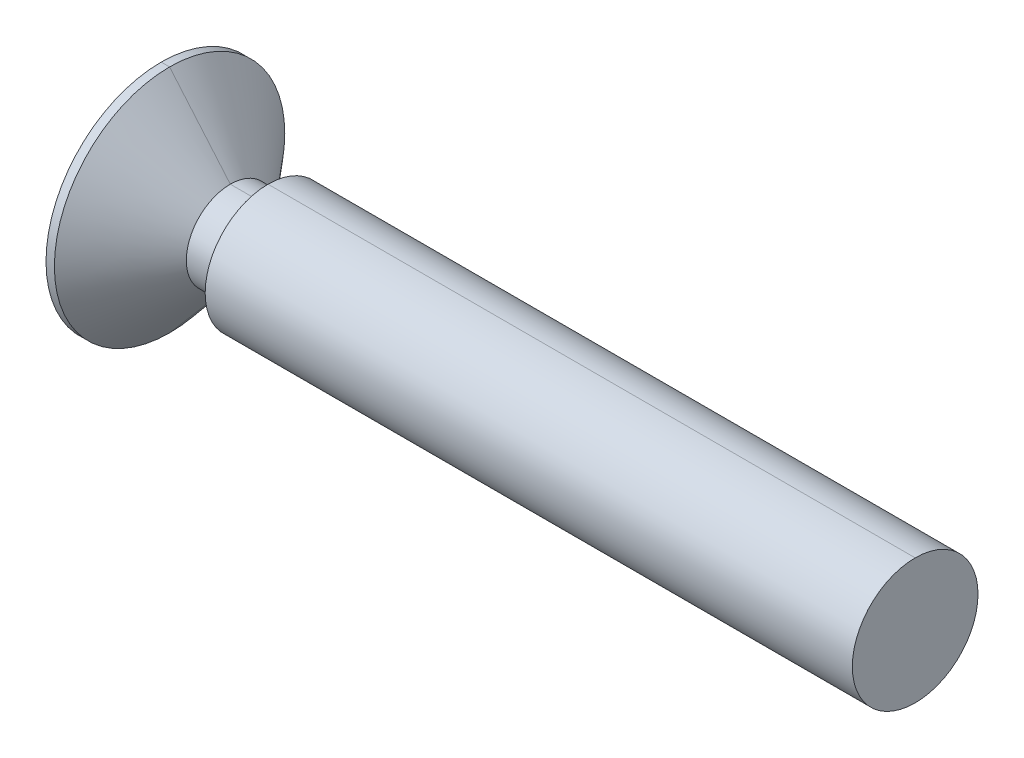
ISO-10303-21;
HEADER;
FILE_DESCRIPTION(('STEP AP214'),'2;1');
FILE_NAME('part.step','',(''),(''),'','','');
FILE_SCHEMA(('AUTOMOTIVE_DESIGN { 1 0 10303 214 1 1 1 1 }'));
ENDSEC;
DATA;
#1=APPLICATION_CONTEXT('core data for automotive mechanical design processes');
#2=APPLICATION_PROTOCOL_DEFINITION('international standard','automotive_design',2000,#1);
#3=PRODUCT_CONTEXT('',#1,'mechanical');
#4=PRODUCT('Part','Part','',(#3));
#5=PRODUCT_RELATED_PRODUCT_CATEGORY('part','',(#4));
#6=PRODUCT_DEFINITION_FORMATION('','',#4);
#7=PRODUCT_DEFINITION_CONTEXT('part definition',#1,'design');
#8=PRODUCT_DEFINITION('design','',#6,#7);
#9=PRODUCT_DEFINITION_SHAPE('','',#8);
#10=(LENGTH_UNIT() NAMED_UNIT(*) SI_UNIT(.MILLI.,.METRE.));
#11=(NAMED_UNIT(*) PLANE_ANGLE_UNIT() SI_UNIT($,.RADIAN.));
#12=(NAMED_UNIT(*) SI_UNIT($,.STERADIAN.) SOLID_ANGLE_UNIT());
#13=UNCERTAINTY_MEASURE_WITH_UNIT(LENGTH_MEASURE(1.E-05),#10,'distance_accuracy_value','');
#14=(GEOMETRIC_REPRESENTATION_CONTEXT(3) GLOBAL_UNCERTAINTY_ASSIGNED_CONTEXT((#13)) GLOBAL_UNIT_ASSIGNED_CONTEXT((#10,
#11,#12)) REPRESENTATION_CONTEXT('',''));
#15=CARTESIAN_POINT('',(0.,0.,0.));
#16=DIRECTION('',(0.,0.,1.));
#17=DIRECTION('',(1.,0.,0.));
#18=AXIS2_PLACEMENT_3D('',#15,#16,#17);
#19=CARTESIAN_POINT('',(-17.175,0.675,-0.675));
#20=DIRECTION('',(1.,0.,0.));
#21=DIRECTION('',(0.,1.,0.));
#22=AXIS2_PLACEMENT_3D('',#19,#20,#21);
#23=PLANE('',#22);
#24=DIRECTION('',(0.,-1.,0.));
#25=VECTOR('',#24,1.);
#26=CARTESIAN_POINT('',(-17.175,1.8,-0.375));
#27=LINE('',#26,#25);
#28=CARTESIAN_POINT('',(-17.175,1.8,-0.375));
#29=VERTEX_POINT('',#28);
#30=CARTESIAN_POINT('',(-17.175,0.675,-0.375));
#31=VERTEX_POINT('',#30);
#32=EDGE_CURVE('E326',#29,#31,#27,.T.);
#33=ORIENTED_EDGE('',*,*,#32,.T.);
#34=CARTESIAN_POINT('',(-17.175,0.675,-0.675));
#35=DIRECTION('',(1.,0.,0.));
#36=DIRECTION('',(0.,1.,0.));
#37=AXIS2_PLACEMENT_3D('',#34,#35,#36);
#38=CIRCLE('',#37,0.3);
#39=CARTESIAN_POINT('',(-17.175,0.375,-0.675));
#40=VERTEX_POINT('',#39);
#41=EDGE_CURVE('E10',#31,#40,#38,.T.);
#42=ORIENTED_EDGE('',*,*,#41,.T.);
#43=DIRECTION('',(0.,0.,-1.));
#44=VECTOR('',#43,1.);
#45=CARTESIAN_POINT('',(-17.175,0.375,-1.8));
#46=LINE('',#45,#44);
#47=CARTESIAN_POINT('',(-17.175,0.375,-1.8));
#48=VERTEX_POINT('',#47);
#49=EDGE_CURVE('E257',#40,#48,#46,.T.);
#50=ORIENTED_EDGE('',*,*,#49,.T.);
#51=DIRECTION('',(0.,-1.,0.));
#52=VECTOR('',#51,1.);
#53=CARTESIAN_POINT('',(-17.175,0.375,-1.8));
#54=LINE('',#53,#52);
#55=CARTESIAN_POINT('',(-17.175,-0.375,-1.8));
#56=VERTEX_POINT('',#55);
#57=EDGE_CURVE('E348',#48,#56,#54,.T.);
#58=ORIENTED_EDGE('',*,*,#57,.T.);
#59=DIRECTION('',(0.,0.,1.));
#60=VECTOR('',#59,1.);
#61=CARTESIAN_POINT('',(-17.175,-0.375,-1.8));
#62=LINE('',#61,#60);
#63=CARTESIAN_POINT('',(-17.175,-0.375,-0.675));
#64=VERTEX_POINT('',#63);
#65=EDGE_CURVE('E349',#56,#64,#62,.T.);
#66=ORIENTED_EDGE('',*,*,#65,.T.);
#67=CARTESIAN_POINT('',(-17.175,-0.675,-0.675));
#68=DIRECTION('',(1.,0.,0.));
#69=DIRECTION('',(0.,-1.,0.));
#70=AXIS2_PLACEMENT_3D('',#67,#68,#69);
#71=CIRCLE('',#70,0.3);
#72=CARTESIAN_POINT('',(-17.175,-0.675,-0.375));
#73=VERTEX_POINT('',#72);
#74=EDGE_CURVE('E307',#64,#73,#71,.T.);
#75=ORIENTED_EDGE('',*,*,#74,.T.);
#76=DIRECTION('',(0.,-1.,0.));
#77=VECTOR('',#76,1.);
#78=CARTESIAN_POINT('',(-17.175,-0.675,-0.375));
#79=LINE('',#78,#77);
#80=CARTESIAN_POINT('',(-17.175,-1.8,-0.375));
#81=VERTEX_POINT('',#80);
#82=EDGE_CURVE('E308',#73,#81,#79,.T.);
#83=ORIENTED_EDGE('',*,*,#82,.T.);
#84=DIRECTION('',(0.,0.,1.));
#85=VECTOR('',#84,1.);
#86=CARTESIAN_POINT('',(-17.175,-1.8,-0.375));
#87=LINE('',#86,#85);
#88=CARTESIAN_POINT('',(-17.175,-1.8,0.375));
#89=VERTEX_POINT('',#88);
#90=EDGE_CURVE('E404',#81,#89,#87,.T.);
#91=ORIENTED_EDGE('',*,*,#90,.T.);
#92=DIRECTION('',(0.,1.,0.));
#93=VECTOR('',#92,1.);
#94=CARTESIAN_POINT('',(-17.175,-0.675,0.375));
#95=LINE('',#94,#93);
#96=CARTESIAN_POINT('',(-17.175,-0.675,0.375));
#97=VERTEX_POINT('',#96);
#98=EDGE_CURVE('E255',#89,#97,#95,.T.);
#99=ORIENTED_EDGE('',*,*,#98,.T.);
#100=CARTESIAN_POINT('',(-17.175,-0.675,0.675));
#101=DIRECTION('',(1.,0.,0.));
#102=DIRECTION('',(0.,1.,0.));
#103=AXIS2_PLACEMENT_3D('',#100,#101,#102);
#104=CIRCLE('',#103,0.3);
#105=CARTESIAN_POINT('',(-17.175,-0.375,0.675));
#106=VERTEX_POINT('',#105);
#107=EDGE_CURVE('E421',#97,#106,#104,.T.);
#108=ORIENTED_EDGE('',*,*,#107,.T.);
#109=DIRECTION('',(0.,0.,1.));
#110=VECTOR('',#109,1.);
#111=CARTESIAN_POINT('',(-17.175,-0.375,0.675));
#112=LINE('',#111,#110);
#113=CARTESIAN_POINT('',(-17.175,-0.375,1.8));
#114=VERTEX_POINT('',#113);
#115=EDGE_CURVE('E434',#106,#114,#112,.T.);
#116=ORIENTED_EDGE('',*,*,#115,.T.);
#117=DIRECTION('',(0.,1.,0.));
#118=VECTOR('',#117,1.);
#119=CARTESIAN_POINT('',(-17.175,0.375,1.8));
#120=LINE('',#119,#118);
#121=CARTESIAN_POINT('',(-17.175,0.375,1.8));
#122=VERTEX_POINT('',#121);
#123=EDGE_CURVE('E447',#114,#122,#120,.T.);
#124=ORIENTED_EDGE('',*,*,#123,.T.);
#125=DIRECTION('',(0.,0.,-1.));
#126=VECTOR('',#125,1.);
#127=CARTESIAN_POINT('',(-17.175,0.375,0.675));
#128=LINE('',#127,#126);
#129=CARTESIAN_POINT('',(-17.175,0.375,0.675));
#130=VERTEX_POINT('',#129);
#131=EDGE_CURVE('E339',#122,#130,#128,.T.);
#132=ORIENTED_EDGE('',*,*,#131,.T.);
#133=CARTESIAN_POINT('',(-17.175,0.675,0.675));
#134=DIRECTION('',(1.,0.,0.));
#135=DIRECTION('',(0.,1.,0.));
#136=AXIS2_PLACEMENT_3D('',#133,#134,#135);
#137=CIRCLE('',#136,0.3);
#138=CARTESIAN_POINT('',(-17.175,0.675,0.375));
#139=VERTEX_POINT('',#138);
#140=EDGE_CURVE('E333',#130,#139,#137,.T.);
#141=ORIENTED_EDGE('',*,*,#140,.T.);
#142=DIRECTION('',(0.,1.,0.));
#143=VECTOR('',#142,1.);
#144=CARTESIAN_POINT('',(-17.175,1.8,0.375));
#145=LINE('',#144,#143);
#146=CARTESIAN_POINT('',(-17.175,1.8,0.375));
#147=VERTEX_POINT('',#146);
#148=EDGE_CURVE('E334',#139,#147,#145,.T.);
#149=ORIENTED_EDGE('',*,*,#148,.T.);
#150=DIRECTION('',(0.,0.,-1.));
#151=VECTOR('',#150,1.);
#152=CARTESIAN_POINT('',(-17.175,1.8,-0.375));
#153=LINE('',#152,#151);
#154=EDGE_CURVE('E330',#147,#29,#153,.T.);
#155=ORIENTED_EDGE('',*,*,#154,.T.);
#156=EDGE_LOOP('',(#33,#42,#50,#58,#66,#75,#83,#91,#99,#108,#116,#124,#132,#141,#149,#155));
#157=FACE_BOUND('',#156,.T.);
#158=ADVANCED_FACE('F16',(#157),#23,.F.);
#159=CARTESIAN_POINT('',(-17.175,0.675,-0.675));
#160=DIRECTION('',(-1.,0.,0.));
#161=DIRECTION('',(0.,-1.,0.));
#162=AXIS2_PLACEMENT_3D('',#159,#160,#161);
#163=CYLINDRICAL_SURFACE('',#162,0.3);
#164=CARTESIAN_POINT('',(-18.,0.675,-0.675));
#165=DIRECTION('',(1.,0.,0.));
#166=DIRECTION('',(0.,1.,0.));
#167=AXIS2_PLACEMENT_3D('',#164,#165,#166);
#168=CIRCLE('',#167,0.3);
#169=CARTESIAN_POINT('',(-18.,0.675,-0.375));
#170=VERTEX_POINT('',#169);
#171=CARTESIAN_POINT('',(-18.,0.375,-0.675));
#172=VERTEX_POINT('',#171);
#173=EDGE_CURVE('E20',#170,#172,#168,.T.);
#174=ORIENTED_EDGE('',*,*,#173,.T.);
#175=DIRECTION('',(-1.,0.,0.));
#176=VECTOR('',#175,1.);
#177=CARTESIAN_POINT('',(-17.175,0.375,-0.675));
#178=LINE('',#177,#176);
#179=EDGE_CURVE('E27',#40,#172,#178,.T.);
#180=ORIENTED_EDGE('',*,*,#179,.F.);
#181=ORIENTED_EDGE('',*,*,#41,.F.);
#182=DIRECTION('',(-1.,0.,0.));
#183=VECTOR('',#182,1.);
#184=CARTESIAN_POINT('',(-17.175,0.675,-0.375));
#185=LINE('',#184,#183);
#186=EDGE_CURVE('E323',#31,#170,#185,.T.);
#187=ORIENTED_EDGE('',*,*,#186,.T.);
#188=EDGE_LOOP('',(#174,#180,#181,#187));
#189=FACE_BOUND('',#188,.T.);
#190=ADVANCED_FACE('F847',(#189),#163,.T.);
#191=CARTESIAN_POINT('',(-17.175,0.375,-1.8));
#192=DIRECTION('',(0.,1.,0.));
#193=DIRECTION('',(1.,0.,0.));
#194=AXIS2_PLACEMENT_3D('',#191,#192,#193);
#195=PLANE('',#194);
#196=DIRECTION('',(0.,0.,-1.));
#197=VECTOR('',#196,1.);
#198=CARTESIAN_POINT('',(-18.,0.375,-1.8));
#199=LINE('',#198,#197);
#200=CARTESIAN_POINT('',(-18.,0.375,-1.8));
#201=VERTEX_POINT('',#200);
#202=EDGE_CURVE('E266',#172,#201,#199,.T.);
#203=ORIENTED_EDGE('',*,*,#202,.T.);
#204=DIRECTION('',(-1.,0.,0.));
#205=VECTOR('',#204,1.);
#206=CARTESIAN_POINT('',(-17.175,0.375,-1.8));
#207=LINE('',#206,#205);
#208=EDGE_CURVE('E259',#48,#201,#207,.T.);
#209=ORIENTED_EDGE('',*,*,#208,.F.);
#210=ORIENTED_EDGE('',*,*,#49,.F.);
#211=ORIENTED_EDGE('',*,*,#179,.T.);
#212=EDGE_LOOP('',(#203,#209,#210,#211));
#213=FACE_BOUND('',#212,.T.);
#214=ADVANCED_FACE('F841',(#213),#195,.F.);
#215=CARTESIAN_POINT('',(-17.175,0.375,-1.8));
#216=DIRECTION('',(0.,0.,-1.));
#217=DIRECTION('',(0.,-1.,0.));
#218=AXIS2_PLACEMENT_3D('',#215,#216,#217);
#219=PLANE('',#218);
#220=DIRECTION('',(0.,-1.,0.));
#221=VECTOR('',#220,1.);
#222=CARTESIAN_POINT('',(-18.,0.375,-1.8));
#223=LINE('',#222,#221);
#224=CARTESIAN_POINT('',(-18.,-0.375,-1.8));
#225=VERTEX_POINT('',#224);
#226=EDGE_CURVE('E262',#201,#225,#223,.T.);
#227=ORIENTED_EDGE('',*,*,#226,.T.);
#228=DIRECTION('',(-1.,0.,0.));
#229=VECTOR('',#228,1.);
#230=CARTESIAN_POINT('',(-17.175,-0.375,-1.8));
#231=LINE('',#230,#229);
#232=EDGE_CURVE('E345',#56,#225,#231,.T.);
#233=ORIENTED_EDGE('',*,*,#232,.F.);
#234=ORIENTED_EDGE('',*,*,#57,.F.);
#235=ORIENTED_EDGE('',*,*,#208,.T.);
#236=EDGE_LOOP('',(#227,#233,#234,#235));
#237=FACE_BOUND('',#236,.T.);
#238=ADVANCED_FACE('F836',(#237),#219,.F.);
#239=CARTESIAN_POINT('',(-17.175,-0.375,-1.8));
#240=DIRECTION('',(0.,-1.,0.));
#241=DIRECTION('',(0.,0.,-1.));
#242=AXIS2_PLACEMENT_3D('',#239,#240,#241);
#243=PLANE('',#242);
#244=DIRECTION('',(0.,0.,1.));
#245=VECTOR('',#244,1.);
#246=CARTESIAN_POINT('',(-18.,-0.375,-1.8));
#247=LINE('',#246,#245);
#248=CARTESIAN_POINT('',(-18.,-0.375,-0.675));
#249=VERTEX_POINT('',#248);
#250=EDGE_CURVE('E267',#225,#249,#247,.T.);
#251=ORIENTED_EDGE('',*,*,#250,.T.);
#252=DIRECTION('',(-1.,0.,0.));
#253=VECTOR('',#252,1.);
#254=CARTESIAN_POINT('',(-17.175,-0.375,-0.675));
#255=LINE('',#254,#253);
#256=EDGE_CURVE('E316',#64,#249,#255,.T.);
#257=ORIENTED_EDGE('',*,*,#256,.F.);
#258=ORIENTED_EDGE('',*,*,#65,.F.);
#259=ORIENTED_EDGE('',*,*,#232,.T.);
#260=EDGE_LOOP('',(#251,#257,#258,#259));
#261=FACE_BOUND('',#260,.T.);
#262=ADVANCED_FACE('F840',(#261),#243,.F.);
#263=CARTESIAN_POINT('',(-17.175,-0.675,-0.675));
#264=DIRECTION('',(-1.,0.,0.));
#265=DIRECTION('',(0.,-1.,0.));
#266=AXIS2_PLACEMENT_3D('',#263,#264,#265);
#267=CYLINDRICAL_SURFACE('',#266,0.3);
#268=CARTESIAN_POINT('',(-18.,-0.675,-0.675));
#269=DIRECTION('',(1.,0.,0.));
#270=DIRECTION('',(0.,-1.,0.));
#271=AXIS2_PLACEMENT_3D('',#268,#269,#270);
#272=CIRCLE('',#271,0.3);
#273=CARTESIAN_POINT('',(-18.,-0.675,-0.375));
#274=VERTEX_POINT('',#273);
#275=EDGE_CURVE('E299',#249,#274,#272,.T.);
#276=ORIENTED_EDGE('',*,*,#275,.T.);
#277=DIRECTION('',(-1.,0.,0.));
#278=VECTOR('',#277,1.);
#279=CARTESIAN_POINT('',(-17.175,-0.675,-0.375));
#280=LINE('',#279,#278);
#281=EDGE_CURVE('E304',#73,#274,#280,.T.);
#282=ORIENTED_EDGE('',*,*,#281,.F.);
#283=ORIENTED_EDGE('',*,*,#74,.F.);
#284=ORIENTED_EDGE('',*,*,#256,.T.);
#285=EDGE_LOOP('',(#276,#282,#283,#284));
#286=FACE_BOUND('',#285,.T.);
#287=ADVANCED_FACE('F541',(#286),#267,.T.);
#288=CARTESIAN_POINT('',(-17.175,-0.675,-0.375));
#289=DIRECTION('',(0.,0.,-1.));
#290=DIRECTION('',(0.,-1.,0.));
#291=AXIS2_PLACEMENT_3D('',#288,#289,#290);
#292=PLANE('',#291);
#293=DIRECTION('',(0.,-1.,0.));
#294=VECTOR('',#293,1.);
#295=CARTESIAN_POINT('',(-18.,-0.675,-0.375));
#296=LINE('',#295,#294);
#297=CARTESIAN_POINT('',(-18.,-1.8,-0.375));
#298=VERTEX_POINT('',#297);
#299=EDGE_CURVE('E309',#274,#298,#296,.T.);
#300=ORIENTED_EDGE('',*,*,#299,.T.);
#301=DIRECTION('',(-1.,0.,0.));
#302=VECTOR('',#301,1.);
#303=CARTESIAN_POINT('',(-17.175,-1.8,-0.375));
#304=LINE('',#303,#302);
#305=EDGE_CURVE('E394',#81,#298,#304,.T.);
#306=ORIENTED_EDGE('',*,*,#305,.F.);
#307=ORIENTED_EDGE('',*,*,#82,.F.);
#308=ORIENTED_EDGE('',*,*,#281,.T.);
#309=EDGE_LOOP('',(#300,#306,#307,#308));
#310=FACE_BOUND('',#309,.T.);
#311=ADVANCED_FACE('F537',(#310),#292,.F.);
#312=CARTESIAN_POINT('',(-17.175,-1.8,-0.375));
#313=DIRECTION('',(0.,-1.,0.));
#314=DIRECTION('',(0.,0.,-1.));
#315=AXIS2_PLACEMENT_3D('',#312,#313,#314);
#316=PLANE('',#315);
#317=DIRECTION('',(0.,0.,1.));
#318=VECTOR('',#317,1.);
#319=CARTESIAN_POINT('',(-18.,-1.8,-0.375));
#320=LINE('',#319,#318);
#321=CARTESIAN_POINT('',(-18.,-1.8,0.375));
#322=VERTEX_POINT('',#321);
#323=EDGE_CURVE('E313',#298,#322,#320,.T.);
#324=ORIENTED_EDGE('',*,*,#323,.T.);
#325=DIRECTION('',(-1.,0.,0.));
#326=VECTOR('',#325,1.);
#327=CARTESIAN_POINT('',(-17.175,-1.8,0.375));
#328=LINE('',#327,#326);
#329=EDGE_CURVE('E407',#89,#322,#328,.T.);
#330=ORIENTED_EDGE('',*,*,#329,.F.);
#331=ORIENTED_EDGE('',*,*,#90,.F.);
#332=ORIENTED_EDGE('',*,*,#305,.T.);
#333=EDGE_LOOP('',(#324,#330,#331,#332));
#334=FACE_BOUND('',#333,.T.);
#335=ADVANCED_FACE('F532',(#334),#316,.F.);
#336=CARTESIAN_POINT('',(-17.175,-0.675,0.375));
#337=DIRECTION('',(0.,0.,1.));
#338=DIRECTION('',(0.,-1.,0.));
#339=AXIS2_PLACEMENT_3D('',#336,#337,#338);
#340=PLANE('',#339);
#341=DIRECTION('',(0.,1.,0.));
#342=VECTOR('',#341,1.);
#343=CARTESIAN_POINT('',(-18.,-0.675,0.375));
#344=LINE('',#343,#342);
#345=CARTESIAN_POINT('',(-18.,-0.675,0.375));
#346=VERTEX_POINT('',#345);
#347=EDGE_CURVE('E388',#322,#346,#344,.T.);
#348=ORIENTED_EDGE('',*,*,#347,.T.);
#349=DIRECTION('',(-1.,0.,0.));
#350=VECTOR('',#349,1.);
#351=CARTESIAN_POINT('',(-17.175,-0.675,0.375));
#352=LINE('',#351,#350);
#353=EDGE_CURVE('E418',#97,#346,#352,.T.);
#354=ORIENTED_EDGE('',*,*,#353,.F.);
#355=ORIENTED_EDGE('',*,*,#98,.F.);
#356=ORIENTED_EDGE('',*,*,#329,.T.);
#357=EDGE_LOOP('',(#348,#354,#355,#356));
#358=FACE_BOUND('',#357,.T.);
#359=ADVANCED_FACE('F526',(#358),#340,.F.);
#360=CARTESIAN_POINT('',(-17.175,-0.675,0.675));
#361=DIRECTION('',(-1.,0.,0.));
#362=DIRECTION('',(0.,-1.,0.));
#363=AXIS2_PLACEMENT_3D('',#360,#361,#362);
#364=CYLINDRICAL_SURFACE('',#363,0.3);
#365=CARTESIAN_POINT('',(-18.,-0.675,0.675));
#366=DIRECTION('',(1.,0.,0.));
#367=DIRECTION('',(0.,1.,0.));
#368=AXIS2_PLACEMENT_3D('',#365,#366,#367);
#369=CIRCLE('',#368,0.3);
#370=CARTESIAN_POINT('',(-18.,-0.375,0.675));
#371=VERTEX_POINT('',#370);
#372=EDGE_CURVE('E321',#346,#371,#369,.T.);
#373=ORIENTED_EDGE('',*,*,#372,.T.);
#374=DIRECTION('',(-1.,0.,0.));
#375=VECTOR('',#374,1.);
#376=CARTESIAN_POINT('',(-17.175,-0.375,0.675));
#377=LINE('',#376,#375);
#378=EDGE_CURVE('E437',#106,#371,#377,.T.);
#379=ORIENTED_EDGE('',*,*,#378,.F.);
#380=ORIENTED_EDGE('',*,*,#107,.F.);
#381=ORIENTED_EDGE('',*,*,#353,.T.);
#382=EDGE_LOOP('',(#373,#379,#380,#381));
#383=FACE_BOUND('',#382,.T.);
#384=ADVANCED_FACE('F522',(#383),#364,.T.);
#385=CARTESIAN_POINT('',(-17.175,-0.375,0.675));
#386=DIRECTION('',(0.,-1.,0.));
#387=DIRECTION('',(0.,0.,-1.));
#388=AXIS2_PLACEMENT_3D('',#385,#386,#387);
#389=PLANE('',#388);
#390=DIRECTION('',(0.,0.,1.));
#391=VECTOR('',#390,1.);
#392=CARTESIAN_POINT('',(-18.,-0.375,0.675));
#393=LINE('',#392,#391);
#394=CARTESIAN_POINT('',(-18.,-0.375,1.8));
#395=VERTEX_POINT('',#394);
#396=EDGE_CURVE('E317',#371,#395,#393,.T.);
#397=ORIENTED_EDGE('',*,*,#396,.T.);
#398=DIRECTION('',(-1.,0.,0.));
#399=VECTOR('',#398,1.);
#400=CARTESIAN_POINT('',(-17.175,-0.375,1.8));
#401=LINE('',#400,#399);
#402=EDGE_CURVE('E438',#114,#395,#401,.T.);
#403=ORIENTED_EDGE('',*,*,#402,.F.);
#404=ORIENTED_EDGE('',*,*,#115,.F.);
#405=ORIENTED_EDGE('',*,*,#378,.T.);
#406=EDGE_LOOP('',(#397,#403,#404,#405));
#407=FACE_BOUND('',#406,.T.);
#408=ADVANCED_FACE('F517',(#407),#389,.F.);
#409=CARTESIAN_POINT('',(-17.175,0.375,1.8));
#410=DIRECTION('',(0.,0.,1.));
#411=DIRECTION('',(1.,0.,0.));
#412=AXIS2_PLACEMENT_3D('',#409,#410,#411);
#413=PLANE('',#412);
#414=DIRECTION('',(0.,1.,0.));
#415=VECTOR('',#414,1.);
#416=CARTESIAN_POINT('',(-18.,0.375,1.8));
#417=LINE('',#416,#415);
#418=CARTESIAN_POINT('',(-18.,0.375,1.8));
#419=VERTEX_POINT('',#418);
#420=EDGE_CURVE('E322',#395,#419,#417,.T.);
#421=ORIENTED_EDGE('',*,*,#420,.T.);
#422=DIRECTION('',(-1.,0.,0.));
#423=VECTOR('',#422,1.);
#424=CARTESIAN_POINT('',(-17.175,0.375,1.8));
#425=LINE('',#424,#423);
#426=EDGE_CURVE('E357',#122,#419,#425,.T.);
#427=ORIENTED_EDGE('',*,*,#426,.F.);
#428=ORIENTED_EDGE('',*,*,#123,.F.);
#429=ORIENTED_EDGE('',*,*,#402,.T.);
#430=EDGE_LOOP('',(#421,#427,#428,#429));
#431=FACE_BOUND('',#430,.T.);
#432=ADVANCED_FACE('F511',(#431),#413,.F.);
#433=CARTESIAN_POINT('',(-17.175,0.375,0.675));
#434=DIRECTION('',(0.,1.,0.));
#435=DIRECTION('',(0.,0.,-1.));
#436=AXIS2_PLACEMENT_3D('',#433,#434,#435);
#437=PLANE('',#436);
#438=DIRECTION('',(0.,0.,-1.));
#439=VECTOR('',#438,1.);
#440=CARTESIAN_POINT('',(-18.,0.375,0.675));
#441=LINE('',#440,#439);
#442=CARTESIAN_POINT('',(-18.,0.375,0.675));
#443=VERTEX_POINT('',#442);
#444=EDGE_CURVE('E340',#419,#443,#441,.T.);
#445=ORIENTED_EDGE('',*,*,#444,.T.);
#446=DIRECTION('',(-1.,0.,0.));
#447=VECTOR('',#446,1.);
#448=CARTESIAN_POINT('',(-17.175,0.375,0.675));
#449=LINE('',#448,#447);
#450=EDGE_CURVE('E336',#130,#443,#449,.T.);
#451=ORIENTED_EDGE('',*,*,#450,.F.);
#452=ORIENTED_EDGE('',*,*,#131,.F.);
#453=ORIENTED_EDGE('',*,*,#426,.T.);
#454=EDGE_LOOP('',(#445,#451,#452,#453));
#455=FACE_BOUND('',#454,.T.);
#456=ADVANCED_FACE('F507',(#455),#437,.F.);
#457=CARTESIAN_POINT('',(-17.175,0.675,0.675));
#458=DIRECTION('',(-1.,0.,0.));
#459=DIRECTION('',(0.,-1.,0.));
#460=AXIS2_PLACEMENT_3D('',#457,#458,#459);
#461=CYLINDRICAL_SURFACE('',#460,0.3);
#462=CARTESIAN_POINT('',(-18.,0.675,0.675));
#463=DIRECTION('',(1.,0.,0.));
#464=DIRECTION('',(0.,1.,0.));
#465=AXIS2_PLACEMENT_3D('',#462,#463,#464);
#466=CIRCLE('',#465,0.3);
#467=CARTESIAN_POINT('',(-18.,0.675,0.375));
#468=VERTEX_POINT('',#467);
#469=EDGE_CURVE('E344',#443,#468,#466,.T.);
#470=ORIENTED_EDGE('',*,*,#469,.T.);
#471=DIRECTION('',(-1.,0.,0.));
#472=VECTOR('',#471,1.);
#473=CARTESIAN_POINT('',(-17.175,0.675,0.375));
#474=LINE('',#473,#472);
#475=EDGE_CURVE('E331',#139,#468,#474,.T.);
#476=ORIENTED_EDGE('',*,*,#475,.F.);
#477=ORIENTED_EDGE('',*,*,#140,.F.);
#478=ORIENTED_EDGE('',*,*,#450,.T.);
#479=EDGE_LOOP('',(#470,#476,#477,#478));
#480=FACE_BOUND('',#479,.T.);
#481=ADVANCED_FACE('F503',(#480),#461,.T.);
#482=CARTESIAN_POINT('',(-17.175,1.8,0.375));
#483=DIRECTION('',(0.,0.,1.));
#484=DIRECTION('',(0.,-1.,0.));
#485=AXIS2_PLACEMENT_3D('',#482,#483,#484);
#486=PLANE('',#485);
#487=DIRECTION('',(0.,1.,0.));
#488=VECTOR('',#487,1.);
#489=CARTESIAN_POINT('',(-18.,1.8,0.375));
#490=LINE('',#489,#488);
#491=CARTESIAN_POINT('',(-18.,1.8,0.375));
#492=VERTEX_POINT('',#491);
#493=EDGE_CURVE('E381',#468,#492,#490,.T.);
#494=ORIENTED_EDGE('',*,*,#493,.T.);
#495=DIRECTION('',(-1.,0.,0.));
#496=VECTOR('',#495,1.);
#497=CARTESIAN_POINT('',(-17.175,1.8,0.375));
#498=LINE('',#497,#496);
#499=EDGE_CURVE('E397',#147,#492,#498,.T.);
#500=ORIENTED_EDGE('',*,*,#499,.F.);
#501=ORIENTED_EDGE('',*,*,#148,.F.);
#502=ORIENTED_EDGE('',*,*,#475,.T.);
#503=EDGE_LOOP('',(#494,#500,#501,#502));
#504=FACE_BOUND('',#503,.T.);
#505=ADVANCED_FACE('F498',(#504),#486,.F.);
#506=CARTESIAN_POINT('',(-17.175,1.8,-0.375));
#507=DIRECTION('',(0.,1.,0.));
#508=DIRECTION('',(0.,0.,-1.));
#509=AXIS2_PLACEMENT_3D('',#506,#507,#508);
#510=PLANE('',#509);
#511=DIRECTION('',(0.,0.,-1.));
#512=VECTOR('',#511,1.);
#513=CARTESIAN_POINT('',(-18.,1.8,-0.375));
#514=LINE('',#513,#512);
#515=CARTESIAN_POINT('',(-18.,1.8,-0.375));
#516=VERTEX_POINT('',#515);
#517=EDGE_CURVE('E383',#492,#516,#514,.T.);
#518=ORIENTED_EDGE('',*,*,#517,.T.);
#519=DIRECTION('',(-1.,0.,0.));
#520=VECTOR('',#519,1.);
#521=CARTESIAN_POINT('',(-17.175,1.8,-0.375));
#522=LINE('',#521,#520);
#523=EDGE_CURVE('E327',#29,#516,#522,.T.);
#524=ORIENTED_EDGE('',*,*,#523,.F.);
#525=ORIENTED_EDGE('',*,*,#154,.F.);
#526=ORIENTED_EDGE('',*,*,#499,.T.);
#527=EDGE_LOOP('',(#518,#524,#525,#526));
#528=FACE_BOUND('',#527,.T.);
#529=ADVANCED_FACE('F481',(#528),#510,.F.);
#530=CARTESIAN_POINT('',(-17.175,1.8,-0.375));
#531=DIRECTION('',(0.,0.,-1.));
#532=DIRECTION('',(0.,-1.,0.));
#533=AXIS2_PLACEMENT_3D('',#530,#531,#532);
#534=PLANE('',#533);
#535=DIRECTION('',(0.,-1.,0.));
#536=VECTOR('',#535,1.);
#537=CARTESIAN_POINT('',(-18.,1.8,-0.375));
#538=LINE('',#537,#536);
#539=EDGE_CURVE('E302',#516,#170,#538,.T.);
#540=ORIENTED_EDGE('',*,*,#539,.T.);
#541=ORIENTED_EDGE('',*,*,#186,.F.);
#542=ORIENTED_EDGE('',*,*,#32,.F.);
#543=ORIENTED_EDGE('',*,*,#523,.T.);
#544=EDGE_LOOP('',(#540,#541,#542,#543));
#545=FACE_BOUND('',#544,.T.);
#546=ADVANCED_FACE('F493',(#545),#534,.F.);
#547=CARTESIAN_POINT('',(-18.,2.75,0.));
#548=DIRECTION('',(-1.,0.,0.));
#549=DIRECTION('',(0.,1.,0.));
#550=AXIS2_PLACEMENT_3D('',#547,#548,#549);
#551=PLANE('',#550);
#552=ORIENTED_EDGE('',*,*,#539,.F.);
#553=ORIENTED_EDGE('',*,*,#517,.F.);
#554=ORIENTED_EDGE('',*,*,#493,.F.);
#555=ORIENTED_EDGE('',*,*,#469,.F.);
#556=ORIENTED_EDGE('',*,*,#444,.F.);
#557=ORIENTED_EDGE('',*,*,#420,.F.);
#558=ORIENTED_EDGE('',*,*,#396,.F.);
#559=ORIENTED_EDGE('',*,*,#372,.F.);
#560=ORIENTED_EDGE('',*,*,#347,.F.);
#561=ORIENTED_EDGE('',*,*,#323,.F.);
#562=ORIENTED_EDGE('',*,*,#299,.F.);
#563=ORIENTED_EDGE('',*,*,#275,.F.);
#564=ORIENTED_EDGE('',*,*,#250,.F.);
#565=ORIENTED_EDGE('',*,*,#226,.F.);
#566=ORIENTED_EDGE('',*,*,#202,.F.);
#567=ORIENTED_EDGE('',*,*,#173,.F.);
#568=EDGE_LOOP('',(#552,#553,#554,#555,#556,#557,#558,#559,#560,#561,#562,#563,#564,#565,#566,#567));
#569=FACE_BOUND('',#568,.T.);
#570=CARTESIAN_POINT('',(-18.,0.,0.));
#571=DIRECTION('',(1.,0.,0.));
#572=DIRECTION('',(0.,1.,0.));
#573=AXIS2_PLACEMENT_3D('',#570,#571,#572);
#574=CIRCLE('',#573,2.75);
#575=CARTESIAN_POINT('',(-18.,2.75,0.));
#576=VERTEX_POINT('',#575);
#577=CARTESIAN_POINT('',(-18.,-2.75,0.));
#578=VERTEX_POINT('',#577);
#579=EDGE_CURVE('E379',#576,#578,#574,.T.);
#580=ORIENTED_EDGE('',*,*,#579,.F.);
#581=CARTESIAN_POINT('',(-18.,0.,0.));
#582=DIRECTION('',(1.,0.,0.));
#583=DIRECTION('',(0.,1.,0.));
#584=AXIS2_PLACEMENT_3D('',#581,#582,#583);
#585=CIRCLE('',#584,2.75);
#586=EDGE_CURVE('E116',#578,#576,#585,.T.);
#587=ORIENTED_EDGE('',*,*,#586,.F.);
#588=EDGE_LOOP('',(#580,#587));
#589=FACE_BOUND('',#588,.T.);
#590=ADVANCED_FACE('F488',(#569,#589),#551,.T.);
#591=CARTESIAN_POINT('',(0.,0.,0.));
#592=DIRECTION('',(1.,0.,0.));
#593=DIRECTION('',(0.,1.,0.));
#594=AXIS2_PLACEMENT_3D('',#591,#592,#593);
#595=CYLINDRICAL_SURFACE('',#594,2.75);
#596=DIRECTION('',(1.,0.,0.));
#597=VECTOR('',#596,1.);
#598=CARTESIAN_POINT('',(0.,-2.75,0.));
#599=LINE('',#598,#597);
#600=CARTESIAN_POINT('',(-17.8,-2.75,0.));
#601=VERTEX_POINT('',#600);
#602=EDGE_CURVE('E387',#578,#601,#599,.T.);
#603=ORIENTED_EDGE('',*,*,#602,.F.);
#604=ORIENTED_EDGE('',*,*,#586,.T.);
#605=DIRECTION('',(1.,0.,0.));
#606=VECTOR('',#605,1.);
#607=CARTESIAN_POINT('',(0.,2.75,0.));
#608=LINE('',#607,#606);
#609=CARTESIAN_POINT('',(-17.8,2.75,0.));
#610=VERTEX_POINT('',#609);
#611=EDGE_CURVE('E293',#576,#610,#608,.T.);
#612=ORIENTED_EDGE('',*,*,#611,.T.);
#613=CARTESIAN_POINT('',(-17.8,0.,0.));
#614=DIRECTION('',(1.,0.,0.));
#615=DIRECTION('',(0.,1.,0.));
#616=AXIS2_PLACEMENT_3D('',#613,#614,#615);
#617=CIRCLE('',#616,2.75);
#618=EDGE_CURVE('E303',#601,#610,#617,.T.);
#619=ORIENTED_EDGE('',*,*,#618,.F.);
#620=EDGE_LOOP('',(#603,#604,#612,#619));
#621=FACE_BOUND('',#620,.T.);
#622=ADVANCED_FACE('F730',(#621),#595,.T.);
#623=CARTESIAN_POINT('',(-16.35,0.,0.));
#624=DIRECTION('',(-1.,0.,0.));
#625=DIRECTION('',(0.,-1.,0.));
#626=AXIS2_PLACEMENT_3D('',#623,#624,#625);
#627=CONICAL_SURFACE('',#626,1.05,0.864597234366899);
#628=DIRECTION('',(-0.64894660608275,0.760833951959085,0.));
#629=VECTOR('',#628,1.);
#630=CARTESIAN_POINT('',(-16.35,1.05,0.));
#631=LINE('',#630,#629);
#632=CARTESIAN_POINT('',(-16.35,1.05,0.));
#633=VERTEX_POINT('',#632);
#634=EDGE_CURVE('E272',#633,#610,#631,.T.);
#635=ORIENTED_EDGE('',*,*,#634,.F.);
#636=CARTESIAN_POINT('',(-16.35,0.,0.));
#637=DIRECTION('',(1.,0.,0.));
#638=DIRECTION('',(0.,1.,0.));
#639=AXIS2_PLACEMENT_3D('',#636,#637,#638);
#640=CIRCLE('',#639,1.05);
#641=CARTESIAN_POINT('',(-16.35,-1.05,0.));
#642=VERTEX_POINT('',#641);
#643=EDGE_CURVE('E361',#642,#633,#640,.T.);
#644=ORIENTED_EDGE('',*,*,#643,.F.);
#645=DIRECTION('',(-0.64894660608275,-0.760833951959086,0.));
#646=VECTOR('',#645,1.);
#647=CARTESIAN_POINT('',(-16.35,-1.05,0.));
#648=LINE('',#647,#646);
#649=EDGE_CURVE('E268',#642,#601,#648,.T.);
#650=ORIENTED_EDGE('',*,*,#649,.T.);
#651=ORIENTED_EDGE('',*,*,#618,.T.);
#652=EDGE_LOOP('',(#635,#644,#650,#651));
#653=FACE_BOUND('',#652,.T.);
#654=ADVANCED_FACE('F18',(#653),#627,.T.);
#655=CARTESIAN_POINT('',(0.,0.,0.));
#656=DIRECTION('',(1.,0.,0.));
#657=DIRECTION('',(0.,1.,0.));
#658=AXIS2_PLACEMENT_3D('',#655,#656,#657);
#659=CYLINDRICAL_SURFACE('',#658,1.05);
#660=DIRECTION('',(1.,0.,0.));
#661=VECTOR('',#660,1.);
#662=CARTESIAN_POINT('',(0.,-1.05,0.));
#663=LINE('',#662,#661);
#664=CARTESIAN_POINT('',(-15.45,-1.05,0.));
#665=VERTEX_POINT('',#664);
#666=EDGE_CURVE('E271',#642,#665,#663,.T.);
#667=ORIENTED_EDGE('',*,*,#666,.F.);
#668=ORIENTED_EDGE('',*,*,#643,.T.);
#669=DIRECTION('',(1.,0.,0.));
#670=VECTOR('',#669,1.);
#671=CARTESIAN_POINT('',(0.,1.05,0.));
#672=LINE('',#671,#670);
#673=CARTESIAN_POINT('',(-15.45,1.05,0.));
#674=VERTEX_POINT('',#673);
#675=EDGE_CURVE('E244',#633,#674,#672,.T.);
#676=ORIENTED_EDGE('',*,*,#675,.T.);
#677=CARTESIAN_POINT('',(-15.45,0.,0.));
#678=DIRECTION('',(1.,0.,0.));
#679=DIRECTION('',(0.,1.,0.));
#680=AXIS2_PLACEMENT_3D('',#677,#678,#679);
#681=CIRCLE('',#680,1.05);
#682=EDGE_CURVE('E229',#665,#674,#681,.T.);
#683=ORIENTED_EDGE('',*,*,#682,.F.);
#684=EDGE_LOOP('',(#667,#668,#676,#683));
#685=FACE_BOUND('',#684,.T.);
#686=ADVANCED_FACE('F729',(#685),#659,.T.);
#687=CARTESIAN_POINT('',(-15.45,1.5,0.));
#688=DIRECTION('',(-1.,0.,0.));
#689=DIRECTION('',(0.,1.,0.));
#690=AXIS2_PLACEMENT_3D('',#687,#688,#689);
#691=PLANE('',#690);
#692=CARTESIAN_POINT('',(-15.45,0.,0.));
#693=DIRECTION('',(1.,0.,0.));
#694=DIRECTION('',(0.,1.,0.));
#695=AXIS2_PLACEMENT_3D('',#692,#693,#694);
#696=CIRCLE('',#695,1.05);
#697=EDGE_CURVE('E252',#674,#665,#696,.T.);
#698=ORIENTED_EDGE('',*,*,#697,.T.);
#699=ORIENTED_EDGE('',*,*,#682,.T.);
#700=EDGE_LOOP('',(#698,#699));
#701=FACE_BOUND('',#700,.T.);
#702=CARTESIAN_POINT('',(-15.45,0.,0.));
#703=DIRECTION('',(1.,0.,0.));
#704=DIRECTION('',(0.,1.,0.));
#705=AXIS2_PLACEMENT_3D('',#702,#703,#704);
#706=CIRCLE('',#705,1.5);
#707=CARTESIAN_POINT('',(-15.45,1.5,0.));
#708=VERTEX_POINT('',#707);
#709=CARTESIAN_POINT('',(-15.45,-1.5,0.));
#710=VERTEX_POINT('',#709);
#711=EDGE_CURVE('E224',#708,#710,#706,.T.);
#712=ORIENTED_EDGE('',*,*,#711,.F.);
#713=CARTESIAN_POINT('',(-15.45,0.,0.));
#714=DIRECTION('',(1.,0.,0.));
#715=DIRECTION('',(0.,1.,0.));
#716=AXIS2_PLACEMENT_3D('',#713,#714,#715);
#717=CIRCLE('',#716,1.5);
#718=EDGE_CURVE('E220',#710,#708,#717,.T.);
#719=ORIENTED_EDGE('',*,*,#718,.F.);
#720=EDGE_LOOP('',(#712,#719));
#721=FACE_BOUND('',#720,.T.);
#722=ADVANCED_FACE('F222',(#701,#721),#691,.T.);
#723=CARTESIAN_POINT('',(0.,0.,0.));
#724=DIRECTION('',(1.,0.,0.));
#725=DIRECTION('',(0.,1.,0.));
#726=AXIS2_PLACEMENT_3D('',#723,#724,#725);
#727=CYLINDRICAL_SURFACE('',#726,1.5);
#728=DIRECTION('',(1.,0.,0.));
#729=VECTOR('',#728,1.);
#730=CARTESIAN_POINT('',(0.,-1.5,0.));
#731=LINE('',#730,#729);
#732=CARTESIAN_POINT('',(0.,-1.5,0.));
#733=VERTEX_POINT('',#732);
#734=EDGE_CURVE('E233',#710,#733,#731,.T.);
#735=ORIENTED_EDGE('',*,*,#734,.F.);
#736=ORIENTED_EDGE('',*,*,#718,.T.);
#737=DIRECTION('',(1.,0.,0.));
#738=VECTOR('',#737,1.);
#739=CARTESIAN_POINT('',(0.,1.5,0.));
#740=LINE('',#739,#738);
#741=CARTESIAN_POINT('',(0.,1.5,0.));
#742=VERTEX_POINT('',#741);
#743=EDGE_CURVE('E242',#708,#742,#740,.T.);
#744=ORIENTED_EDGE('',*,*,#743,.T.);
#745=CARTESIAN_POINT('',(0.,0.,0.));
#746=DIRECTION('',(1.,0.,0.));
#747=DIRECTION('',(0.,1.,0.));
#748=AXIS2_PLACEMENT_3D('',#745,#746,#747);
#749=CIRCLE('',#748,1.5);
#750=EDGE_CURVE('E230',#733,#742,#749,.T.);
#751=ORIENTED_EDGE('',*,*,#750,.F.);
#752=EDGE_LOOP('',(#735,#736,#744,#751));
#753=FACE_BOUND('',#752,.T.);
#754=ADVANCED_FACE('F234',(#753),#727,.T.);
#755=CARTESIAN_POINT('',(0.,0.,0.));
#756=DIRECTION('',(1.,0.,0.));
#757=DIRECTION('',(0.,1.,0.));
#758=AXIS2_PLACEMENT_3D('',#755,#756,#757);
#759=PLANE('',#758);
#760=CARTESIAN_POINT('',(0.,0.,0.));
#761=DIRECTION('',(1.,0.,0.));
#762=DIRECTION('',(0.,1.,0.));
#763=AXIS2_PLACEMENT_3D('',#760,#761,#762);
#764=CIRCLE('',#763,1.5);
#765=EDGE_CURVE('E239',#742,#733,#764,.T.);
#766=ORIENTED_EDGE('',*,*,#765,.T.);
#767=ORIENTED_EDGE('',*,*,#750,.T.);
#768=EDGE_LOOP('',(#766,#767));
#769=FACE_BOUND('',#768,.T.);
#770=ADVANCED_FACE('F737',(#769),#759,.T.);
#771=CARTESIAN_POINT('',(0.,0.,0.));
#772=DIRECTION('',(1.,0.,0.));
#773=DIRECTION('',(0.,1.,0.));
#774=AXIS2_PLACEMENT_3D('',#771,#772,#773);
#775=CYLINDRICAL_SURFACE('',#774,1.5);
#776=ORIENTED_EDGE('',*,*,#711,.T.);
#777=ORIENTED_EDGE('',*,*,#734,.T.);
#778=ORIENTED_EDGE('',*,*,#765,.F.);
#779=ORIENTED_EDGE('',*,*,#743,.F.);
#780=EDGE_LOOP('',(#776,#777,#778,#779));
#781=FACE_BOUND('',#780,.T.);
#782=ADVANCED_FACE('F241',(#781),#775,.T.);
#783=CARTESIAN_POINT('',(0.,0.,0.));
#784=DIRECTION('',(1.,0.,0.));
#785=DIRECTION('',(0.,1.,0.));
#786=AXIS2_PLACEMENT_3D('',#783,#784,#785);
#787=CYLINDRICAL_SURFACE('',#786,1.05);
#788=CARTESIAN_POINT('',(-16.35,0.,0.));
#789=DIRECTION('',(1.,0.,0.));
#790=DIRECTION('',(0.,1.,0.));
#791=AXIS2_PLACEMENT_3D('',#788,#789,#790);
#792=CIRCLE('',#791,1.05);
#793=EDGE_CURVE('E283',#633,#642,#792,.T.);
#794=ORIENTED_EDGE('',*,*,#793,.T.);
#795=ORIENTED_EDGE('',*,*,#666,.T.);
#796=ORIENTED_EDGE('',*,*,#697,.F.);
#797=ORIENTED_EDGE('',*,*,#675,.F.);
#798=EDGE_LOOP('',(#794,#795,#796,#797));
#799=FACE_BOUND('',#798,.T.);
#800=ADVANCED_FACE('F760',(#799),#787,.T.);
#801=CARTESIAN_POINT('',(-16.35,0.,0.));
#802=DIRECTION('',(-1.,0.,0.));
#803=DIRECTION('',(0.,-1.,0.));
#804=AXIS2_PLACEMENT_3D('',#801,#802,#803);
#805=CONICAL_SURFACE('',#804,1.05,0.864597234366899);
#806=ORIENTED_EDGE('',*,*,#793,.F.);
#807=ORIENTED_EDGE('',*,*,#634,.T.);
#808=CARTESIAN_POINT('',(-17.8,0.,0.));
#809=DIRECTION('',(1.,0.,0.));
#810=DIRECTION('',(0.,1.,0.));
#811=AXIS2_PLACEMENT_3D('',#808,#809,#810);
#812=CIRCLE('',#811,2.75);
#813=EDGE_CURVE('E352',#610,#601,#812,.T.);
#814=ORIENTED_EDGE('',*,*,#813,.T.);
#815=ORIENTED_EDGE('',*,*,#649,.F.);
#816=EDGE_LOOP('',(#806,#807,#814,#815));
#817=FACE_BOUND('',#816,.T.);
#818=ADVANCED_FACE('F755',(#817),#805,.T.);
#819=CARTESIAN_POINT('',(0.,0.,0.));
#820=DIRECTION('',(1.,0.,0.));
#821=DIRECTION('',(0.,1.,0.));
#822=AXIS2_PLACEMENT_3D('',#819,#820,#821);
#823=CYLINDRICAL_SURFACE('',#822,2.75);
#824=ORIENTED_EDGE('',*,*,#579,.T.);
#825=ORIENTED_EDGE('',*,*,#602,.T.);
#826=ORIENTED_EDGE('',*,*,#813,.F.);
#827=ORIENTED_EDGE('',*,*,#611,.F.);
#828=EDGE_LOOP('',(#824,#825,#826,#827));
#829=FACE_BOUND('',#828,.T.);
#830=ADVANCED_FACE('F759',(#829),#823,.T.);
#831=CLOSED_SHELL('',(#158,#190,#214,#238,#262,#287,#311,#335,#359,#384,#408,#432,#456,#481,
#505,#529,#546,#590,#622,#654,#686,#722,#754,#770,#782,#800,#818,#830));
#832=MANIFOLD_SOLID_BREP('B1',#831);
#833=ADVANCED_BREP_SHAPE_REPRESENTATION('',(#18,#832),#14);
#834=SHAPE_DEFINITION_REPRESENTATION(#9,#833);
ENDSEC;
END-ISO-10303-21;
